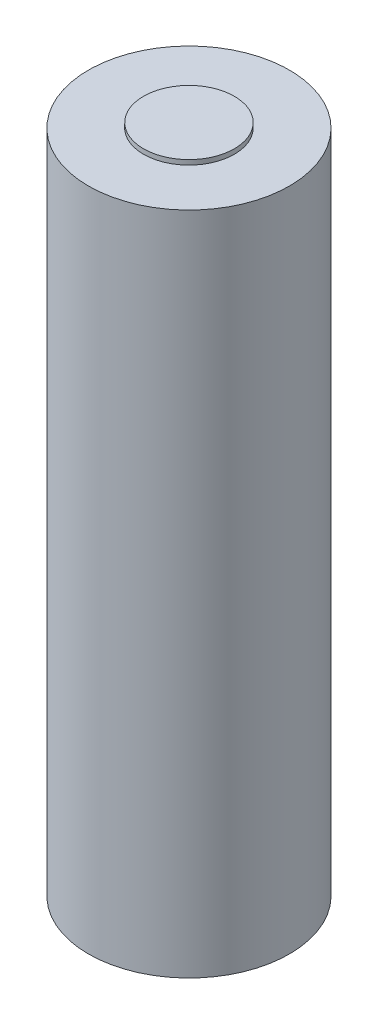
ISO-10303-21;
HEADER;
FILE_DESCRIPTION(('STEP AP214'),'2;1');
FILE_NAME('part.step','',(''),(''),'','','');
FILE_SCHEMA(('AUTOMOTIVE_DESIGN { 1 0 10303 214 1 1 1 1 }'));
ENDSEC;
DATA;
#1=APPLICATION_CONTEXT('core data for automotive mechanical design processes');
#2=APPLICATION_PROTOCOL_DEFINITION('international standard','automotive_design',2000,#1);
#3=PRODUCT_CONTEXT('',#1,'mechanical');
#4=PRODUCT('Part','Part','',(#3));
#5=PRODUCT_RELATED_PRODUCT_CATEGORY('part','',(#4));
#6=PRODUCT_DEFINITION_FORMATION('','',#4);
#7=PRODUCT_DEFINITION_CONTEXT('part definition',#1,'design');
#8=PRODUCT_DEFINITION('design','',#6,#7);
#9=PRODUCT_DEFINITION_SHAPE('','',#8);
#10=(LENGTH_UNIT() NAMED_UNIT(*) SI_UNIT(.MILLI.,.METRE.));
#11=(NAMED_UNIT(*) PLANE_ANGLE_UNIT() SI_UNIT($,.RADIAN.));
#12=(NAMED_UNIT(*) SI_UNIT($,.STERADIAN.) SOLID_ANGLE_UNIT());
#13=UNCERTAINTY_MEASURE_WITH_UNIT(LENGTH_MEASURE(1.E-05),#10,'distance_accuracy_value','');
#14=(GEOMETRIC_REPRESENTATION_CONTEXT(3) GLOBAL_UNCERTAINTY_ASSIGNED_CONTEXT((#13)) GLOBAL_UNIT_ASSIGNED_CONTEXT((#10,
#11,#12)) REPRESENTATION_CONTEXT('',''));
#15=CARTESIAN_POINT('',(0.,0.,0.));
#16=DIRECTION('',(0.,0.,1.));
#17=DIRECTION('',(1.,0.,0.));
#18=AXIS2_PLACEMENT_3D('',#15,#16,#17);
#19=CARTESIAN_POINT('',(0.,70.,0.));
#20=DIRECTION('',(0.,-1.,0.));
#21=DIRECTION('',(0.,0.,-1.));
#22=AXIS2_PLACEMENT_3D('',#19,#20,#21);
#23=CYLINDRICAL_SURFACE('',#22,10.5);
#24=CARTESIAN_POINT('',(0.,0.,0.));
#25=DIRECTION('',(0.,1.,0.));
#26=DIRECTION('',(0.,0.,1.));
#27=AXIS2_PLACEMENT_3D('',#24,#25,#26);
#28=CIRCLE('',#27,10.5);
#29=CARTESIAN_POINT('',(0.,0.,10.5));
#30=VERTEX_POINT('',#29);
#31=EDGE_CURVE('E10',#30,#30,#28,.T.);
#32=ORIENTED_EDGE('',*,*,#31,.T.);
#33=EDGE_LOOP('',(#32));
#34=FACE_BOUND('',#33,.T.);
#35=CARTESIAN_POINT('',(0.,69.5,0.));
#36=DIRECTION('',(0.,1.,0.));
#37=DIRECTION('',(0.,0.,1.));
#38=AXIS2_PLACEMENT_3D('',#35,#36,#37);
#39=CIRCLE('',#38,10.5);
#40=CARTESIAN_POINT('',(0.,69.5,10.5));
#41=VERTEX_POINT('',#40);
#42=EDGE_CURVE('E44',#41,#41,#39,.T.);
#43=ORIENTED_EDGE('',*,*,#42,.F.);
#44=EDGE_LOOP('',(#43));
#45=FACE_BOUND('',#44,.T.);
#46=ADVANCED_FACE('F37',(#34,#45),#23,.T.);
#47=CARTESIAN_POINT('',(0.,0.,0.));
#48=DIRECTION('',(0.,1.,0.));
#49=DIRECTION('',(0.,0.,1.));
#50=AXIS2_PLACEMENT_3D('',#47,#48,#49);
#51=PLANE('',#50);
#52=ORIENTED_EDGE('',*,*,#31,.F.);
#53=EDGE_LOOP('',(#52));
#54=FACE_BOUND('',#53,.T.);
#55=ADVANCED_FACE('F73',(#54),#51,.F.);
#56=CARTESIAN_POINT('',(0.,69.5,0.));
#57=DIRECTION('',(0.,1.,0.));
#58=DIRECTION('',(0.,0.,1.));
#59=AXIS2_PLACEMENT_3D('',#56,#57,#58);
#60=PLANE('',#59);
#61=CARTESIAN_POINT('',(0.,69.5,0.));
#62=DIRECTION('',(0.,1.,0.));
#63=DIRECTION('',(0.,0.,1.));
#64=AXIS2_PLACEMENT_3D('',#61,#62,#63);
#65=CIRCLE('',#64,4.75);
#66=CARTESIAN_POINT('',(0.,69.5,4.75));
#67=VERTEX_POINT('',#66);
#68=EDGE_CURVE('E49',#67,#67,#65,.T.);
#69=ORIENTED_EDGE('',*,*,#68,.F.);
#70=EDGE_LOOP('',(#69));
#71=FACE_BOUND('',#70,.T.);
#72=ORIENTED_EDGE('',*,*,#42,.T.);
#73=EDGE_LOOP('',(#72));
#74=FACE_BOUND('',#73,.T.);
#75=ADVANCED_FACE('F65',(#71,#74),#60,.T.);
#76=CARTESIAN_POINT('',(0.,69.5,0.));
#77=DIRECTION('',(0.,1.,0.));
#78=DIRECTION('',(0.,0.,1.));
#79=AXIS2_PLACEMENT_3D('',#76,#77,#78);
#80=CYLINDRICAL_SURFACE('',#79,4.75);
#81=ORIENTED_EDGE('',*,*,#68,.T.);
#82=EDGE_LOOP('',(#81));
#83=FACE_BOUND('',#82,.T.);
#84=CARTESIAN_POINT('',(0.,70.,0.));
#85=DIRECTION('',(0.,1.,0.));
#86=DIRECTION('',(0.,0.,1.));
#87=AXIS2_PLACEMENT_3D('',#84,#85,#86);
#88=CIRCLE('',#87,4.75);
#89=CARTESIAN_POINT('',(0.,70.,4.75));
#90=VERTEX_POINT('',#89);
#91=EDGE_CURVE('E54',#90,#90,#88,.T.);
#92=ORIENTED_EDGE('',*,*,#91,.F.);
#93=EDGE_LOOP('',(#92));
#94=FACE_BOUND('',#93,.T.);
#95=ADVANCED_FACE('F63',(#83,#94),#80,.T.);
#96=CARTESIAN_POINT('',(0.,70.,0.));
#97=DIRECTION('',(0.,1.,0.));
#98=DIRECTION('',(0.,0.,1.));
#99=AXIS2_PLACEMENT_3D('',#96,#97,#98);
#100=PLANE('',#99);
#101=ORIENTED_EDGE('',*,*,#91,.T.);
#102=EDGE_LOOP('',(#101));
#103=FACE_BOUND('',#102,.T.);
#104=ADVANCED_FACE('F61',(#103),#100,.T.);
#105=CLOSED_SHELL('',(#46,#55,#75,#95,#104));
#106=MANIFOLD_SOLID_BREP('B2',#105);
#107=ADVANCED_BREP_SHAPE_REPRESENTATION('',(#18,#106),#14);
#108=SHAPE_DEFINITION_REPRESENTATION(#9,#107);
ENDSEC;
END-ISO-10303-21;
